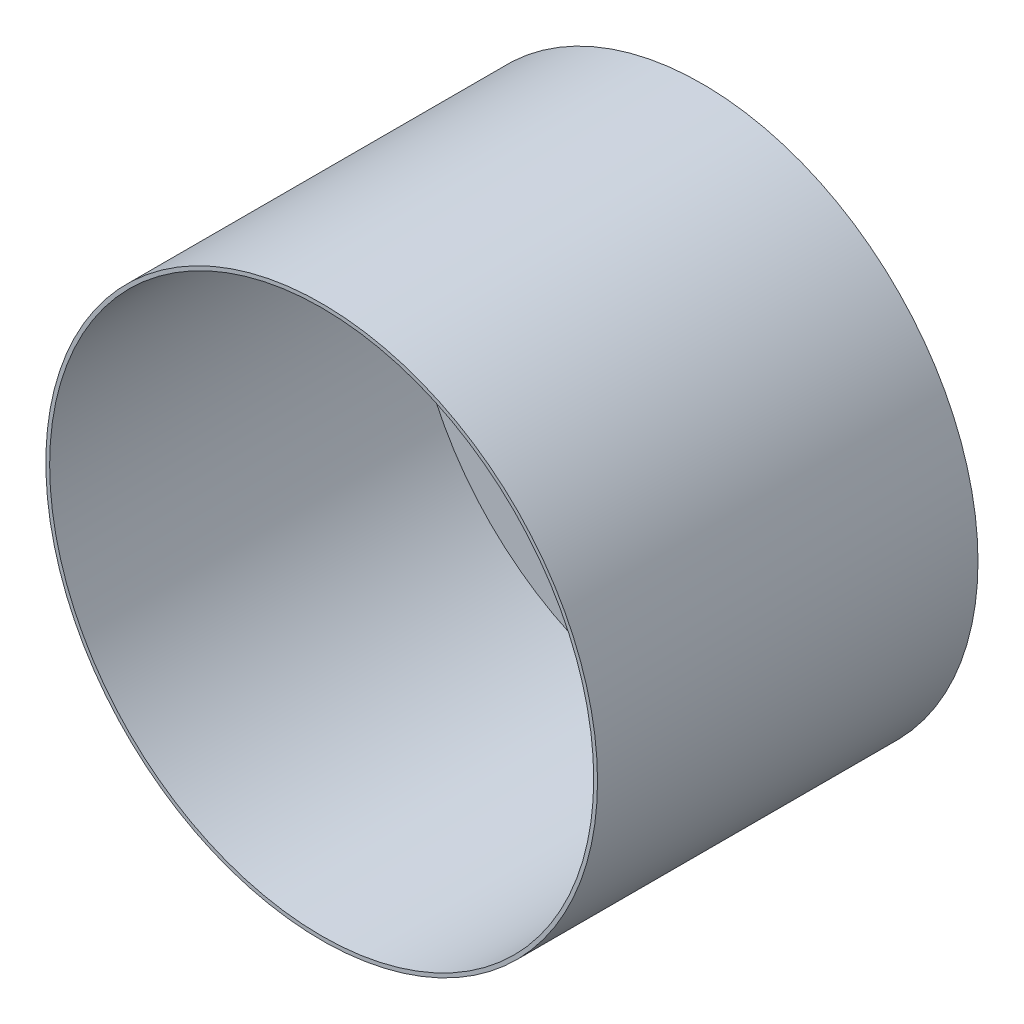
ISO-10303-21;
HEADER;
FILE_DESCRIPTION(('STEP AP214'),'2;1');
FILE_NAME('part.step','',(''),(''),'','','');
FILE_SCHEMA(('AUTOMOTIVE_DESIGN { 1 0 10303 214 1 1 1 1 }'));
ENDSEC;
DATA;
#1=APPLICATION_CONTEXT('core data for automotive mechanical design processes');
#2=APPLICATION_PROTOCOL_DEFINITION('international standard','automotive_design',2000,#1);
#3=PRODUCT_CONTEXT('',#1,'mechanical');
#4=PRODUCT('Part','Part','',(#3));
#5=PRODUCT_RELATED_PRODUCT_CATEGORY('part','',(#4));
#6=PRODUCT_DEFINITION_FORMATION('','',#4);
#7=PRODUCT_DEFINITION_CONTEXT('part definition',#1,'design');
#8=PRODUCT_DEFINITION('design','',#6,#7);
#9=PRODUCT_DEFINITION_SHAPE('','',#8);
#10=(LENGTH_UNIT() NAMED_UNIT(*) SI_UNIT(.MILLI.,.METRE.));
#11=(NAMED_UNIT(*) PLANE_ANGLE_UNIT() SI_UNIT($,.RADIAN.));
#12=(NAMED_UNIT(*) SI_UNIT($,.STERADIAN.) SOLID_ANGLE_UNIT());
#13=UNCERTAINTY_MEASURE_WITH_UNIT(LENGTH_MEASURE(1.E-05),#10,'distance_accuracy_value','');
#14=(GEOMETRIC_REPRESENTATION_CONTEXT(3) GLOBAL_UNCERTAINTY_ASSIGNED_CONTEXT((#13)) GLOBAL_UNIT_ASSIGNED_CONTEXT((#10,
#11,#12)) REPRESENTATION_CONTEXT('',''));
#15=CARTESIAN_POINT('',(0.,0.,0.));
#16=DIRECTION('',(0.,0.,1.));
#17=DIRECTION('',(1.,0.,0.));
#18=AXIS2_PLACEMENT_3D('',#15,#16,#17);
#19=CARTESIAN_POINT('',(0.,0.,10.));
#20=DIRECTION('',(0.,0.,-1.));
#21=DIRECTION('',(-1.,0.,0.));
#22=AXIS2_PLACEMENT_3D('',#19,#20,#21);
#23=CYLINDRICAL_SURFACE('',#22,7.25);
#24=CARTESIAN_POINT('',(0.,0.,10.));
#25=DIRECTION('',(0.,0.,1.));
#26=DIRECTION('',(1.,0.,0.));
#27=AXIS2_PLACEMENT_3D('',#24,#25,#26);
#28=CIRCLE('',#27,7.25);
#29=CARTESIAN_POINT('',(7.25,0.,10.));
#30=VERTEX_POINT('',#29);
#31=EDGE_CURVE('E10',#30,#30,#28,.T.);
#32=ORIENTED_EDGE('',*,*,#31,.F.);
#33=EDGE_LOOP('',(#32));
#34=FACE_BOUND('',#33,.T.);
#35=CARTESIAN_POINT('',(0.,0.,0.));
#36=DIRECTION('',(0.,0.,1.));
#37=DIRECTION('',(1.,0.,0.));
#38=AXIS2_PLACEMENT_3D('',#35,#36,#37);
#39=CIRCLE('',#38,7.25);
#40=CARTESIAN_POINT('',(7.25,0.,0.));
#41=VERTEX_POINT('',#40);
#42=EDGE_CURVE('E34',#41,#41,#39,.T.);
#43=ORIENTED_EDGE('',*,*,#42,.T.);
#44=EDGE_LOOP('',(#43));
#45=FACE_BOUND('',#44,.T.);
#46=ADVANCED_FACE('F31',(#34,#45),#23,.T.);
#47=CARTESIAN_POINT('',(0.,0.,10.));
#48=DIRECTION('',(0.,0.,1.));
#49=DIRECTION('',(1.,0.,0.));
#50=AXIS2_PLACEMENT_3D('',#47,#48,#49);
#51=PLANE('',#50);
#52=CARTESIAN_POINT('',(0.,0.,10.));
#53=DIRECTION('',(0.,0.,1.));
#54=DIRECTION('',(1.,0.,0.));
#55=AXIS2_PLACEMENT_3D('',#52,#53,#54);
#56=CIRCLE('',#55,7.15);
#57=CARTESIAN_POINT('',(7.15,0.,10.));
#58=VERTEX_POINT('',#57);
#59=EDGE_CURVE('E43',#58,#58,#56,.T.);
#60=ORIENTED_EDGE('',*,*,#59,.F.);
#61=EDGE_LOOP('',(#60));
#62=FACE_BOUND('',#61,.T.);
#63=ORIENTED_EDGE('',*,*,#31,.T.);
#64=EDGE_LOOP('',(#63));
#65=FACE_BOUND('',#64,.T.);
#66=ADVANCED_FACE('F58',(#62,#65),#51,.T.);
#67=CARTESIAN_POINT('',(0.,0.,0.));
#68=DIRECTION('',(0.,0.,1.));
#69=DIRECTION('',(1.,0.,0.));
#70=AXIS2_PLACEMENT_3D('',#67,#68,#69);
#71=PLANE('',#70);
#72=ORIENTED_EDGE('',*,*,#42,.F.);
#73=EDGE_LOOP('',(#72));
#74=FACE_BOUND('',#73,.T.);
#75=ADVANCED_FACE('F54',(#74),#71,.F.);
#76=CARTESIAN_POINT('',(0.,0.,0.5));
#77=DIRECTION('',(0.,0.,1.));
#78=DIRECTION('',(1.,0.,0.));
#79=AXIS2_PLACEMENT_3D('',#76,#77,#78);
#80=CYLINDRICAL_SURFACE('',#79,7.15);
#81=CARTESIAN_POINT('',(0.,0.,0.5));
#82=DIRECTION('',(0.,0.,1.));
#83=DIRECTION('',(1.,0.,0.));
#84=AXIS2_PLACEMENT_3D('',#81,#82,#83);
#85=CIRCLE('',#84,7.15);
#86=CARTESIAN_POINT('',(7.15,0.,0.5));
#87=VERTEX_POINT('',#86);
#88=EDGE_CURVE('E41',#87,#87,#85,.T.);
#89=ORIENTED_EDGE('',*,*,#88,.F.);
#90=EDGE_LOOP('',(#89));
#91=FACE_BOUND('',#90,.T.);
#92=ORIENTED_EDGE('',*,*,#59,.T.);
#93=EDGE_LOOP('',(#92));
#94=FACE_BOUND('',#93,.T.);
#95=ADVANCED_FACE('F51',(#91,#94),#80,.F.);
#96=CARTESIAN_POINT('',(0.,0.,0.5));
#97=DIRECTION('',(0.,0.,1.));
#98=DIRECTION('',(1.,0.,0.));
#99=AXIS2_PLACEMENT_3D('',#96,#97,#98);
#100=PLANE('',#99);
#101=ORIENTED_EDGE('',*,*,#88,.T.);
#102=EDGE_LOOP('',(#101));
#103=FACE_BOUND('',#102,.T.);
#104=ADVANCED_FACE('F49',(#103),#100,.T.);
#105=CLOSED_SHELL('',(#46,#66,#75,#95,#104));
#106=MANIFOLD_SOLID_BREP('B2',#105);
#107=ADVANCED_BREP_SHAPE_REPRESENTATION('',(#18,#106),#14);
#108=SHAPE_DEFINITION_REPRESENTATION(#9,#107);
ENDSEC;
END-ISO-10303-21;
